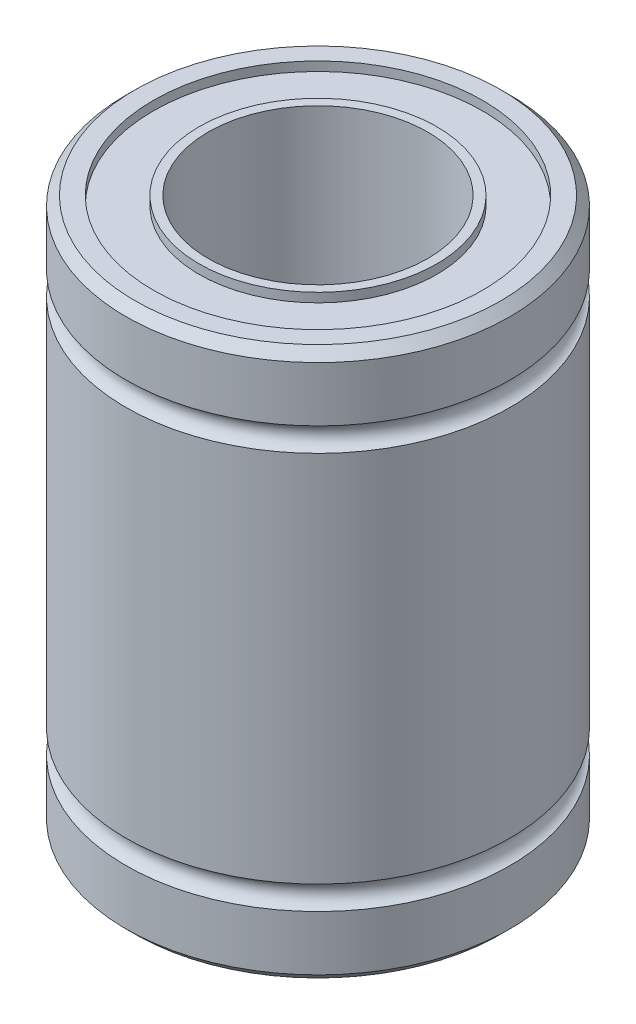
ISO-10303-21;
HEADER;
FILE_DESCRIPTION(('STEP AP214'),'2;1');
FILE_NAME('part.step','',(''),(''),'','','');
FILE_SCHEMA(('AUTOMOTIVE_DESIGN { 1 0 10303 214 1 1 1 1 }'));
ENDSEC;
DATA;
#1=APPLICATION_CONTEXT('core data for automotive mechanical design processes');
#2=APPLICATION_PROTOCOL_DEFINITION('international standard','automotive_design',2000,#1);
#3=PRODUCT_CONTEXT('',#1,'mechanical');
#4=PRODUCT('Part','Part','',(#3));
#5=PRODUCT_RELATED_PRODUCT_CATEGORY('part','',(#4));
#6=PRODUCT_DEFINITION_FORMATION('','',#4);
#7=PRODUCT_DEFINITION_CONTEXT('part definition',#1,'design');
#8=PRODUCT_DEFINITION('design','',#6,#7);
#9=PRODUCT_DEFINITION_SHAPE('','',#8);
#10=(LENGTH_UNIT() NAMED_UNIT(*) SI_UNIT(.MILLI.,.METRE.));
#11=(NAMED_UNIT(*) PLANE_ANGLE_UNIT() SI_UNIT($,.RADIAN.));
#12=(NAMED_UNIT(*) SI_UNIT($,.STERADIAN.) SOLID_ANGLE_UNIT());
#13=UNCERTAINTY_MEASURE_WITH_UNIT(LENGTH_MEASURE(1.E-05),#10,'distance_accuracy_value','');
#14=(GEOMETRIC_REPRESENTATION_CONTEXT(3) GLOBAL_UNCERTAINTY_ASSIGNED_CONTEXT((#13)) GLOBAL_UNIT_ASSIGNED_CONTEXT((#10,
#11,#12)) REPRESENTATION_CONTEXT('',''));
#15=CARTESIAN_POINT('',(0.,0.,0.));
#16=DIRECTION('',(0.,0.,1.));
#17=DIRECTION('',(1.,0.,0.));
#18=AXIS2_PLACEMENT_3D('',#15,#16,#17);
#19=CARTESIAN_POINT('',(0.,15.,0.));
#20=DIRECTION('',(0.,1.,0.));
#21=DIRECTION('',(-1.,0.,0.));
#22=AXIS2_PLACEMENT_3D('',#19,#20,#21);
#23=CYLINDRICAL_SURFACE('',#22,6.);
#24=CARTESIAN_POINT('',(0.,-15.,0.));
#25=DIRECTION('',(0.,1.,0.));
#26=DIRECTION('',(-1.,0.,0.));
#27=AXIS2_PLACEMENT_3D('',#24,#25,#26);
#28=CIRCLE('',#27,6.);
#29=CARTESIAN_POINT('',(-6.,-15.,0.));
#30=VERTEX_POINT('',#29);
#31=EDGE_CURVE('E17',#30,#30,#28,.F.);
#32=ORIENTED_EDGE('',*,*,#31,.T.);
#33=EDGE_LOOP('',(#32));
#34=FACE_BOUND('',#33,.T.);
#35=CARTESIAN_POINT('',(0.,15.,0.));
#36=DIRECTION('',(0.,1.,0.));
#37=DIRECTION('',(-1.,0.,0.));
#38=AXIS2_PLACEMENT_3D('',#35,#36,#37);
#39=CIRCLE('',#38,6.);
#40=CARTESIAN_POINT('',(-6.00000000000001,15.,0.));
#41=VERTEX_POINT('',#40);
#42=EDGE_CURVE('E280',#41,#41,#39,.T.);
#43=ORIENTED_EDGE('',*,*,#42,.T.);
#44=EDGE_LOOP('',(#43));
#45=FACE_BOUND('',#44,.T.);
#46=ADVANCED_FACE('F14',(#34,#45),#23,.F.);
#47=CARTESIAN_POINT('',(10.,-15.,0.));
#48=DIRECTION('',(0.,1.,0.));
#49=DIRECTION('',(-1.,0.,0.));
#50=AXIS2_PLACEMENT_3D('',#47,#48,#49);
#51=PLANE('',#50);
#52=CARTESIAN_POINT('',(0.,-15.,0.));
#53=DIRECTION('',(0.,-1.,0.));
#54=DIRECTION('',(1.,0.,0.));
#55=AXIS2_PLACEMENT_3D('',#52,#53,#54);
#56=CIRCLE('',#55,6.50000000000001);
#57=CARTESIAN_POINT('',(6.5,-15.,0.));
#58=VERTEX_POINT('',#57);
#59=EDGE_CURVE('E277',#58,#58,#56,.F.);
#60=ORIENTED_EDGE('',*,*,#59,.F.);
#61=EDGE_LOOP('',(#60));
#62=FACE_BOUND('',#61,.T.);
#63=ORIENTED_EDGE('',*,*,#31,.F.);
#64=EDGE_LOOP('',(#63));
#65=FACE_BOUND('',#64,.T.);
#66=ADVANCED_FACE('F94',(#62,#65),#51,.F.);
#67=CARTESIAN_POINT('',(6.,15.,0.));
#68=DIRECTION('',(0.,-1.,0.));
#69=DIRECTION('',(1.,0.,0.));
#70=AXIS2_PLACEMENT_3D('',#67,#68,#69);
#71=PLANE('',#70);
#72=CARTESIAN_POINT('',(0.,15.,0.));
#73=DIRECTION('',(0.,1.,0.));
#74=DIRECTION('',(-1.,0.,0.));
#75=AXIS2_PLACEMENT_3D('',#72,#73,#74);
#76=CIRCLE('',#75,6.50000000000001);
#77=CARTESIAN_POINT('',(-6.50000000000001,15.,0.));
#78=VERTEX_POINT('',#77);
#79=EDGE_CURVE('E284',#78,#78,#76,.F.);
#80=ORIENTED_EDGE('',*,*,#79,.F.);
#81=EDGE_LOOP('',(#80));
#82=FACE_BOUND('',#81,.T.);
#83=ORIENTED_EDGE('',*,*,#42,.F.);
#84=EDGE_LOOP('',(#83));
#85=FACE_BOUND('',#84,.T.);
#86=ADVANCED_FACE('F91',(#82,#85),#71,.F.);
#87=CARTESIAN_POINT('',(0.,-14.5,0.));
#88=DIRECTION('',(0.,-1.,0.));
#89=DIRECTION('',(1.,0.,0.));
#90=AXIS2_PLACEMENT_3D('',#87,#88,#89);
#91=CYLINDRICAL_SURFACE('',#90,6.50000000000001);
#92=ORIENTED_EDGE('',*,*,#59,.T.);
#93=EDGE_LOOP('',(#92));
#94=FACE_BOUND('',#93,.T.);
#95=CARTESIAN_POINT('',(0.,-14.5,0.));
#96=DIRECTION('',(0.,-1.,0.));
#97=DIRECTION('',(1.,0.,0.));
#98=AXIS2_PLACEMENT_3D('',#95,#96,#97);
#99=CIRCLE('',#98,6.50000000000001);
#100=CARTESIAN_POINT('',(6.5,-14.5,0.));
#101=VERTEX_POINT('',#100);
#102=EDGE_CURVE('E289',#101,#101,#99,.F.);
#103=ORIENTED_EDGE('',*,*,#102,.F.);
#104=EDGE_LOOP('',(#103));
#105=FACE_BOUND('',#104,.T.);
#106=ADVANCED_FACE('F87',(#94,#105),#91,.T.);
#107=CARTESIAN_POINT('',(0.,14.5,0.));
#108=DIRECTION('',(0.,1.,0.));
#109=DIRECTION('',(-1.,0.,0.));
#110=AXIS2_PLACEMENT_3D('',#107,#108,#109);
#111=CYLINDRICAL_SURFACE('',#110,6.50000000000001);
#112=CARTESIAN_POINT('',(0.,14.5,0.));
#113=DIRECTION('',(0.,1.,0.));
#114=DIRECTION('',(-1.,0.,0.));
#115=AXIS2_PLACEMENT_3D('',#112,#113,#114);
#116=CIRCLE('',#115,6.50000000000001);
#117=CARTESIAN_POINT('',(-6.50000000000001,14.5,0.));
#118=VERTEX_POINT('',#117);
#119=EDGE_CURVE('E292',#118,#118,#116,.F.);
#120=ORIENTED_EDGE('',*,*,#119,.F.);
#121=EDGE_LOOP('',(#120));
#122=FACE_BOUND('',#121,.T.);
#123=ORIENTED_EDGE('',*,*,#79,.T.);
#124=EDGE_LOOP('',(#123));
#125=FACE_BOUND('',#124,.T.);
#126=ADVANCED_FACE('F83',(#122,#125),#111,.T.);
#127=CARTESIAN_POINT('',(0.,-14.5,0.));
#128=DIRECTION('',(0.,-1.,0.));
#129=DIRECTION('',(1.,0.,0.));
#130=AXIS2_PLACEMENT_3D('',#127,#128,#129);
#131=PLANE('',#130);
#132=ORIENTED_EDGE('',*,*,#102,.T.);
#133=EDGE_LOOP('',(#132));
#134=FACE_BOUND('',#133,.T.);
#135=CARTESIAN_POINT('',(0.,-14.5,0.));
#136=DIRECTION('',(0.,-1.,0.));
#137=DIRECTION('',(1.,0.,0.));
#138=AXIS2_PLACEMENT_3D('',#135,#136,#137);
#139=CIRCLE('',#138,9.00000000000001);
#140=CARTESIAN_POINT('',(9.00000000000001,-14.5,0.));
#141=VERTEX_POINT('',#140);
#142=EDGE_CURVE('E295',#141,#141,#139,.T.);
#143=ORIENTED_EDGE('',*,*,#142,.T.);
#144=EDGE_LOOP('',(#143));
#145=FACE_BOUND('',#144,.T.);
#146=ADVANCED_FACE('F79',(#134,#145),#131,.T.);
#147=CARTESIAN_POINT('',(0.,14.5,0.));
#148=DIRECTION('',(0.,1.,0.));
#149=DIRECTION('',(-1.,0.,0.));
#150=AXIS2_PLACEMENT_3D('',#147,#148,#149);
#151=PLANE('',#150);
#152=CARTESIAN_POINT('',(0.,14.5,0.));
#153=DIRECTION('',(0.,1.,0.));
#154=DIRECTION('',(-1.,0.,0.));
#155=AXIS2_PLACEMENT_3D('',#152,#153,#154);
#156=CIRCLE('',#155,9.00000000000001);
#157=CARTESIAN_POINT('',(-9.00000000000001,14.5,0.));
#158=VERTEX_POINT('',#157);
#159=EDGE_CURVE('E298',#158,#158,#156,.T.);
#160=ORIENTED_EDGE('',*,*,#159,.T.);
#161=EDGE_LOOP('',(#160));
#162=FACE_BOUND('',#161,.T.);
#163=ORIENTED_EDGE('',*,*,#119,.T.);
#164=EDGE_LOOP('',(#163));
#165=FACE_BOUND('',#164,.T.);
#166=ADVANCED_FACE('F75',(#162,#165),#151,.T.);
#167=CARTESIAN_POINT('',(0.,-14.5,0.));
#168=DIRECTION('',(0.,-1.,0.));
#169=DIRECTION('',(1.,0.,0.));
#170=AXIS2_PLACEMENT_3D('',#167,#168,#169);
#171=CYLINDRICAL_SURFACE('',#170,9.00000000000001);
#172=CARTESIAN_POINT('',(0.,-15.,0.));
#173=DIRECTION('',(0.,-1.,0.));
#174=DIRECTION('',(1.,0.,0.));
#175=AXIS2_PLACEMENT_3D('',#172,#173,#174);
#176=CIRCLE('',#175,9.00000000000001);
#177=CARTESIAN_POINT('',(9.00000000000001,-15.,0.));
#178=VERTEX_POINT('',#177);
#179=EDGE_CURVE('E301',#178,#178,#176,.T.);
#180=ORIENTED_EDGE('',*,*,#179,.T.);
#181=EDGE_LOOP('',(#180));
#182=FACE_BOUND('',#181,.T.);
#183=ORIENTED_EDGE('',*,*,#142,.F.);
#184=EDGE_LOOP('',(#183));
#185=FACE_BOUND('',#184,.T.);
#186=ADVANCED_FACE('F71',(#182,#185),#171,.F.);
#187=CARTESIAN_POINT('',(0.,14.5,0.));
#188=DIRECTION('',(0.,1.,0.));
#189=DIRECTION('',(-1.,0.,0.));
#190=AXIS2_PLACEMENT_3D('',#187,#188,#189);
#191=CYLINDRICAL_SURFACE('',#190,9.00000000000001);
#192=ORIENTED_EDGE('',*,*,#159,.F.);
#193=EDGE_LOOP('',(#192));
#194=FACE_BOUND('',#193,.T.);
#195=CARTESIAN_POINT('',(0.,15.,0.));
#196=DIRECTION('',(0.,1.,0.));
#197=DIRECTION('',(-1.,0.,0.));
#198=AXIS2_PLACEMENT_3D('',#195,#196,#197);
#199=CIRCLE('',#198,9.00000000000001);
#200=CARTESIAN_POINT('',(-9.00000000000001,15.,0.));
#201=VERTEX_POINT('',#200);
#202=EDGE_CURVE('E304',#201,#201,#199,.T.);
#203=ORIENTED_EDGE('',*,*,#202,.T.);
#204=EDGE_LOOP('',(#203));
#205=FACE_BOUND('',#204,.T.);
#206=ADVANCED_FACE('F67',(#194,#205),#191,.F.);
#207=CARTESIAN_POINT('',(10.,-15.,0.));
#208=DIRECTION('',(0.,1.,0.));
#209=DIRECTION('',(-1.,0.,0.));
#210=AXIS2_PLACEMENT_3D('',#207,#208,#209);
#211=PLANE('',#210);
#212=CARTESIAN_POINT('',(0.,-15.,0.));
#213=DIRECTION('',(0.,1.,0.));
#214=DIRECTION('',(-1.,0.,0.));
#215=AXIS2_PLACEMENT_3D('',#212,#213,#214);
#216=CIRCLE('',#215,10.);
#217=CARTESIAN_POINT('',(-10.,-15.,0.));
#218=VERTEX_POINT('',#217);
#219=EDGE_CURVE('E307',#218,#218,#216,.T.);
#220=ORIENTED_EDGE('',*,*,#219,.F.);
#221=EDGE_LOOP('',(#220));
#222=FACE_BOUND('',#221,.T.);
#223=ORIENTED_EDGE('',*,*,#179,.F.);
#224=EDGE_LOOP('',(#223));
#225=FACE_BOUND('',#224,.T.);
#226=ADVANCED_FACE('F63',(#222,#225),#211,.F.);
#227=CARTESIAN_POINT('',(6.,15.,0.));
#228=DIRECTION('',(0.,-1.,0.));
#229=DIRECTION('',(1.,0.,0.));
#230=AXIS2_PLACEMENT_3D('',#227,#228,#229);
#231=PLANE('',#230);
#232=CARTESIAN_POINT('',(0.,15.,0.));
#233=DIRECTION('',(0.,-1.,0.));
#234=DIRECTION('',(1.,0.,0.));
#235=AXIS2_PLACEMENT_3D('',#232,#233,#234);
#236=CIRCLE('',#235,10.);
#237=CARTESIAN_POINT('',(10.,15.,0.));
#238=VERTEX_POINT('',#237);
#239=EDGE_CURVE('E310',#238,#238,#236,.T.);
#240=ORIENTED_EDGE('',*,*,#239,.F.);
#241=EDGE_LOOP('',(#240));
#242=FACE_BOUND('',#241,.T.);
#243=ORIENTED_EDGE('',*,*,#202,.F.);
#244=EDGE_LOOP('',(#243));
#245=FACE_BOUND('',#244,.T.);
#246=ADVANCED_FACE('F59',(#242,#245),#231,.F.);
#247=CARTESIAN_POINT('',(0.,-14.5,0.));
#248=DIRECTION('',(0.,1.,0.));
#249=DIRECTION('',(-1.,0.,0.));
#250=AXIS2_PLACEMENT_3D('',#247,#248,#249);
#251=CONICAL_SURFACE('',#250,10.5,0.785398163397448);
#252=ORIENTED_EDGE('',*,*,#219,.T.);
#253=EDGE_LOOP('',(#252));
#254=FACE_BOUND('',#253,.T.);
#255=CARTESIAN_POINT('',(0.,-14.5,0.));
#256=DIRECTION('',(0.,1.,0.));
#257=DIRECTION('',(-1.,0.,0.));
#258=AXIS2_PLACEMENT_3D('',#255,#256,#257);
#259=CIRCLE('',#258,10.5);
#260=CARTESIAN_POINT('',(-10.5,-14.5,0.));
#261=VERTEX_POINT('',#260);
#262=EDGE_CURVE('E313',#261,#261,#259,.T.);
#263=ORIENTED_EDGE('',*,*,#262,.F.);
#264=EDGE_LOOP('',(#263));
#265=FACE_BOUND('',#264,.T.);
#266=ADVANCED_FACE('F55',(#254,#265),#251,.T.);
#267=CARTESIAN_POINT('',(0.,14.5,0.));
#268=DIRECTION('',(0.,-1.,0.));
#269=DIRECTION('',(1.,0.,0.));
#270=AXIS2_PLACEMENT_3D('',#267,#268,#269);
#271=CONICAL_SURFACE('',#270,10.5,0.785398163397447);
#272=CARTESIAN_POINT('',(0.,14.5,0.));
#273=DIRECTION('',(0.,1.,0.));
#274=DIRECTION('',(-1.,0.,0.));
#275=AXIS2_PLACEMENT_3D('',#272,#273,#274);
#276=CIRCLE('',#275,10.5);
#277=CARTESIAN_POINT('',(-10.5,14.5,0.));
#278=VERTEX_POINT('',#277);
#279=EDGE_CURVE('E314',#278,#278,#276,.F.);
#280=ORIENTED_EDGE('',*,*,#279,.F.);
#281=EDGE_LOOP('',(#280));
#282=FACE_BOUND('',#281,.T.);
#283=ORIENTED_EDGE('',*,*,#239,.T.);
#284=EDGE_LOOP('',(#283));
#285=FACE_BOUND('',#284,.T.);
#286=ADVANCED_FACE('F51',(#282,#285),#271,.T.);
#287=CARTESIAN_POINT('',(0.,15.,0.));
#288=DIRECTION('',(0.,1.,0.));
#289=DIRECTION('',(-1.,0.,0.));
#290=AXIS2_PLACEMENT_3D('',#287,#288,#289);
#291=CYLINDRICAL_SURFACE('',#290,10.5);
#292=ORIENTED_EDGE('',*,*,#262,.T.);
#293=EDGE_LOOP('',(#292));
#294=FACE_BOUND('',#293,.T.);
#295=CARTESIAN_POINT('',(0.,-11.5,0.));
#296=DIRECTION('',(0.,1.,0.));
#297=DIRECTION('',(-1.,0.,0.));
#298=AXIS2_PLACEMENT_3D('',#295,#296,#297);
#299=CIRCLE('',#298,10.5);
#300=CARTESIAN_POINT('',(-10.5,-11.5,0.));
#301=VERTEX_POINT('',#300);
#302=EDGE_CURVE('E317',#301,#301,#299,.F.);
#303=ORIENTED_EDGE('',*,*,#302,.T.);
#304=EDGE_LOOP('',(#303));
#305=FACE_BOUND('',#304,.T.);
#306=ADVANCED_FACE('F47',(#294,#305),#291,.T.);
#307=CARTESIAN_POINT('',(0.,15.,0.));
#308=DIRECTION('',(0.,1.,0.));
#309=DIRECTION('',(-1.,0.,0.));
#310=AXIS2_PLACEMENT_3D('',#307,#308,#309);
#311=CYLINDRICAL_SURFACE('',#310,10.5);
#312=CARTESIAN_POINT('',(0.,11.5,0.));
#313=DIRECTION('',(0.,1.,0.));
#314=DIRECTION('',(-1.,0.,0.));
#315=AXIS2_PLACEMENT_3D('',#312,#313,#314);
#316=CIRCLE('',#315,10.5);
#317=CARTESIAN_POINT('',(-10.5,11.5,0.));
#318=VERTEX_POINT('',#317);
#319=EDGE_CURVE('E26',#318,#318,#316,.T.);
#320=ORIENTED_EDGE('',*,*,#319,.T.);
#321=EDGE_LOOP('',(#320));
#322=FACE_BOUND('',#321,.T.);
#323=ORIENTED_EDGE('',*,*,#279,.T.);
#324=EDGE_LOOP('',(#323));
#325=FACE_BOUND('',#324,.T.);
#326=ADVANCED_FACE('F43',(#322,#325),#311,.T.);
#327=CARTESIAN_POINT('',(0.,-10.85,0.));
#328=DIRECTION('',(0.,1.,0.));
#329=DIRECTION('',(-1.,0.,0.));
#330=AXIS2_PLACEMENT_3D('',#327,#328,#329);
#331=TOROIDAL_SURFACE('',#330,10.6725,0.672499999999999);
#332=ORIENTED_EDGE('',*,*,#302,.F.);
#333=EDGE_LOOP('',(#332));
#334=FACE_BOUND('',#333,.T.);
#335=CARTESIAN_POINT('',(0.,-10.2,0.));
#336=DIRECTION('',(0.,1.,0.));
#337=DIRECTION('',(-1.,0.,0.));
#338=AXIS2_PLACEMENT_3D('',#335,#336,#337);
#339=CIRCLE('',#338,10.5);
#340=CARTESIAN_POINT('',(-10.5,-10.2,0.));
#341=VERTEX_POINT('',#340);
#342=EDGE_CURVE('E21',#341,#341,#339,.T.);
#343=ORIENTED_EDGE('',*,*,#342,.F.);
#344=EDGE_LOOP('',(#343));
#345=FACE_BOUND('',#344,.T.);
#346=ADVANCED_FACE('F39',(#334,#345),#331,.F.);
#347=CARTESIAN_POINT('',(0.,10.85,0.));
#348=DIRECTION('',(0.,1.,0.));
#349=DIRECTION('',(-1.,0.,0.));
#350=AXIS2_PLACEMENT_3D('',#347,#348,#349);
#351=TOROIDAL_SURFACE('',#350,10.6725,0.672499999999999);
#352=ORIENTED_EDGE('',*,*,#319,.F.);
#353=EDGE_LOOP('',(#352));
#354=FACE_BOUND('',#353,.T.);
#355=CARTESIAN_POINT('',(0.,10.2,0.));
#356=DIRECTION('',(0.,1.,0.));
#357=DIRECTION('',(-1.,0.,0.));
#358=AXIS2_PLACEMENT_3D('',#355,#356,#357);
#359=CIRCLE('',#358,10.5);
#360=CARTESIAN_POINT('',(-10.5,10.2,0.));
#361=VERTEX_POINT('',#360);
#362=EDGE_CURVE('E10',#361,#361,#359,.F.);
#363=ORIENTED_EDGE('',*,*,#362,.F.);
#364=EDGE_LOOP('',(#363));
#365=FACE_BOUND('',#364,.T.);
#366=ADVANCED_FACE('F34',(#354,#365),#351,.F.);
#367=CARTESIAN_POINT('',(0.,15.,0.));
#368=DIRECTION('',(0.,1.,0.));
#369=DIRECTION('',(-1.,0.,0.));
#370=AXIS2_PLACEMENT_3D('',#367,#368,#369);
#371=CYLINDRICAL_SURFACE('',#370,10.5);
#372=ORIENTED_EDGE('',*,*,#342,.T.);
#373=EDGE_LOOP('',(#372));
#374=FACE_BOUND('',#373,.T.);
#375=ORIENTED_EDGE('',*,*,#362,.T.);
#376=EDGE_LOOP('',(#375));
#377=FACE_BOUND('',#376,.T.);
#378=ADVANCED_FACE('F38',(#374,#377),#371,.T.);
#379=CLOSED_SHELL('',(#46,#66,#86,#106,#126,#146,#166,#186,#206,#226,#246,#266,#286,#306,#326,
#346,#366,#378));
#380=MANIFOLD_SOLID_BREP('B1',#379);
#381=ADVANCED_BREP_SHAPE_REPRESENTATION('',(#18,#380),#14);
#382=SHAPE_DEFINITION_REPRESENTATION(#9,#381);
ENDSEC;
END-ISO-10303-21;
